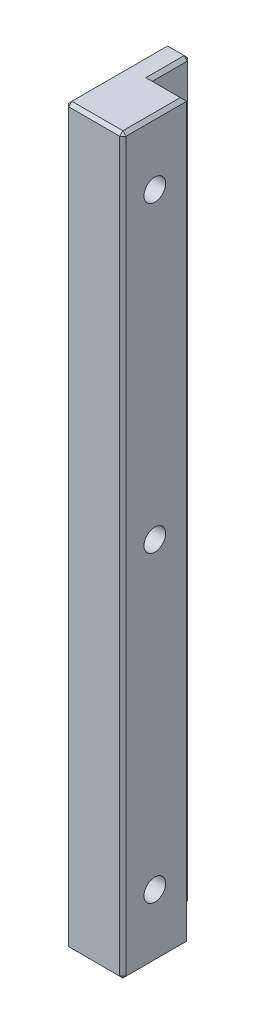
ISO-10303-21;
HEADER;
FILE_DESCRIPTION(('STEP AP214'),'2;1');
FILE_NAME('part.step','',(''),(''),'','','');
FILE_SCHEMA(('AUTOMOTIVE_DESIGN { 1 0 10303 214 1 1 1 1 }'));
ENDSEC;
DATA;
#1=APPLICATION_CONTEXT('core data for automotive mechanical design processes');
#2=APPLICATION_PROTOCOL_DEFINITION('international standard','automotive_design',2000,#1);
#3=PRODUCT_CONTEXT('',#1,'mechanical');
#4=PRODUCT('Part','Part','',(#3));
#5=PRODUCT_RELATED_PRODUCT_CATEGORY('part','',(#4));
#6=PRODUCT_DEFINITION_FORMATION('','',#4);
#7=PRODUCT_DEFINITION_CONTEXT('part definition',#1,'design');
#8=PRODUCT_DEFINITION('design','',#6,#7);
#9=PRODUCT_DEFINITION_SHAPE('','',#8);
#10=(LENGTH_UNIT() NAMED_UNIT(*) SI_UNIT(.MILLI.,.METRE.));
#11=(NAMED_UNIT(*) PLANE_ANGLE_UNIT() SI_UNIT($,.RADIAN.));
#12=(NAMED_UNIT(*) SI_UNIT($,.STERADIAN.) SOLID_ANGLE_UNIT());
#13=UNCERTAINTY_MEASURE_WITH_UNIT(LENGTH_MEASURE(1.E-05),#10,'distance_accuracy_value','');
#14=(GEOMETRIC_REPRESENTATION_CONTEXT(3) GLOBAL_UNCERTAINTY_ASSIGNED_CONTEXT((#13)) GLOBAL_UNIT_ASSIGNED_CONTEXT((#10,
#11,#12)) REPRESENTATION_CONTEXT('',''));
#15=CARTESIAN_POINT('',(0.,0.,0.));
#16=DIRECTION('',(0.,0.,1.));
#17=DIRECTION('',(1.,0.,0.));
#18=AXIS2_PLACEMENT_3D('',#15,#16,#17);
#19=CARTESIAN_POINT('',(99.6018364876299,27.8498798221226,64.2000036621567));
#20=DIRECTION('',(0.,0.,-1.));
#21=DIRECTION('',(0.,-1.,0.));
#22=AXIS2_PLACEMENT_3D('',#19,#20,#21);
#23=PLANE('',#22);
#24=DIRECTION('',(1.,0.,0.));
#25=VECTOR('',#24,1.);
#26=CARTESIAN_POINT('',(100.05183648763,-86.6501201778776,64.2000036621583));
#27=LINE('',#26,#25);
#28=CARTESIAN_POINT('',(99.6018364876299,-86.6501201778776,64.2000036621583));
#29=VERTEX_POINT('',#28);
#30=CARTESIAN_POINT('',(105.00183648763,-86.6501201778776,64.2000036621583));
#31=VERTEX_POINT('',#30);
#32=EDGE_CURVE('E127',#29,#31,#27,.T.);
#33=ORIENTED_EDGE('',*,*,#32,.F.);
#34=DIRECTION('',(0.,-1.,0.));
#35=VECTOR('',#34,1.);
#36=CARTESIAN_POINT('',(99.6018364876299,27.8498798221226,64.2000036621567));
#37=LINE('',#36,#35);
#38=CARTESIAN_POINT('',(99.6018364876299,27.3498798221226,64.2000036621567));
#39=VERTEX_POINT('',#38);
#40=EDGE_CURVE('E27',#39,#29,#37,.T.);
#41=ORIENTED_EDGE('',*,*,#40,.F.);
#42=DIRECTION('',(-1.,0.,0.));
#43=VECTOR('',#42,1.);
#44=CARTESIAN_POINT('',(102.30183648763,27.3498798221226,64.2000036621567));
#45=LINE('',#44,#43);
#46=CARTESIAN_POINT('',(105.00183648763,27.3498798221226,64.2000036621567));
#47=VERTEX_POINT('',#46);
#48=EDGE_CURVE('E67',#47,#39,#45,.T.);
#49=ORIENTED_EDGE('',*,*,#48,.F.);
#50=DIRECTION('',(0.,-1.,0.));
#51=VECTOR('',#50,1.);
#52=CARTESIAN_POINT('',(105.00183648763,27.8498798221226,64.2000036621567));
#53=LINE('',#52,#51);
#54=EDGE_CURVE('E11',#47,#31,#53,.T.);
#55=ORIENTED_EDGE('',*,*,#54,.T.);
#56=EDGE_LOOP('',(#33,#41,#49,#55));
#57=FACE_BOUND('',#56,.T.);
#58=ADVANCED_FACE('F17',(#57),#23,.T.);
#59=CARTESIAN_POINT('',(105.00183648763,27.8498798221226,64.2000036621567));
#60=DIRECTION('',(1.,0.,0.));
#61=DIRECTION('',(0.,1.,0.));
#62=AXIS2_PLACEMENT_3D('',#59,#60,#61);
#63=PLANE('',#62);
#64=CARTESIAN_POINT('',(105.00183648763,17.8498798221227,69.2000036621568));
#65=DIRECTION('',(-1.,0.,0.));
#66=DIRECTION('',(0.,1.,0.));
#67=AXIS2_PLACEMENT_3D('',#64,#65,#66);
#68=CIRCLE('',#67,1.7);
#69=CARTESIAN_POINT('',(105.00183648763,19.5498798221227,69.2000036621568));
#70=VERTEX_POINT('',#69);
#71=EDGE_CURVE('E407',#70,#70,#68,.T.);
#72=ORIENTED_EDGE('',*,*,#71,.T.);
#73=EDGE_LOOP('',(#72));
#74=FACE_BOUND('',#73,.T.);
#75=CARTESIAN_POINT('',(105.00183648763,-77.1501201778776,69.2000036621582));
#76=DIRECTION('',(-1.,0.,0.));
#77=DIRECTION('',(0.,1.,0.));
#78=AXIS2_PLACEMENT_3D('',#75,#76,#77);
#79=CIRCLE('',#78,1.7);
#80=CARTESIAN_POINT('',(105.00183648763,-75.4501201778776,69.2000036621582));
#81=VERTEX_POINT('',#80);
#82=EDGE_CURVE('E414',#81,#81,#79,.T.);
#83=ORIENTED_EDGE('',*,*,#82,.T.);
#84=EDGE_LOOP('',(#83));
#85=FACE_BOUND('',#84,.T.);
#86=CARTESIAN_POINT('',(105.00183648763,-29.6501201778775,69.2000036621575));
#87=DIRECTION('',(-1.,0.,0.));
#88=DIRECTION('',(0.,1.,0.));
#89=AXIS2_PLACEMENT_3D('',#86,#87,#88);
#90=CIRCLE('',#89,1.7);
#91=CARTESIAN_POINT('',(105.00183648763,-27.9501201778775,69.2000036621575));
#92=VERTEX_POINT('',#91);
#93=EDGE_CURVE('E106',#92,#92,#90,.T.);
#94=ORIENTED_EDGE('',*,*,#93,.T.);
#95=EDGE_LOOP('',(#94));
#96=FACE_BOUND('',#95,.T.);
#97=DIRECTION('',(0.,0.,1.));
#98=VECTOR('',#97,1.);
#99=CARTESIAN_POINT('',(105.00183648763,-86.6501201778776,65.2000036621583));
#100=LINE('',#99,#98);
#101=CARTESIAN_POINT('',(105.00183648763,-86.6501201778775,73.7000036621583));
#102=VERTEX_POINT('',#101);
#103=EDGE_CURVE('E64',#31,#102,#100,.T.);
#104=ORIENTED_EDGE('',*,*,#103,.F.);
#105=ORIENTED_EDGE('',*,*,#54,.F.);
#106=DIRECTION('',(0.,0.,-1.));
#107=VECTOR('',#106,1.);
#108=CARTESIAN_POINT('',(105.00183648763,27.3498798221227,73.9500036621569));
#109=LINE('',#108,#107);
#110=CARTESIAN_POINT('',(105.00183648763,27.3498798221227,73.7000036621566));
#111=VERTEX_POINT('',#110);
#112=EDGE_CURVE('E60',#111,#47,#109,.T.);
#113=ORIENTED_EDGE('',*,*,#112,.F.);
#114=DIRECTION('',(0.,1.,0.));
#115=VECTOR('',#114,1.);
#116=CARTESIAN_POINT('',(105.00183648763,27.8498798221227,73.7000036621566));
#117=LINE('',#116,#115);
#118=EDGE_CURVE('E235',#102,#111,#117,.T.);
#119=ORIENTED_EDGE('',*,*,#118,.F.);
#120=EDGE_LOOP('',(#104,#105,#113,#119));
#121=FACE_BOUND('',#120,.T.);
#122=ADVANCED_FACE('F56',(#74,#85,#96,#121),#63,.T.);
#123=CARTESIAN_POINT('',(96.0018364876299,27.8498798221225,58.2000036621567));
#124=DIRECTION('',(0.,0.,-1.));
#125=DIRECTION('',(0.,-1.,0.));
#126=AXIS2_PLACEMENT_3D('',#123,#124,#125);
#127=PLANE('',#126);
#128=DIRECTION('',(0.,1.,0.));
#129=VECTOR('',#128,1.);
#130=CARTESIAN_POINT('',(99.1018364876298,27.8498798221225,58.2000036621566));
#131=LINE('',#130,#129);
#132=CARTESIAN_POINT('',(99.1018364876298,-86.6501201778777,58.2000036621583));
#133=VERTEX_POINT('',#132);
#134=CARTESIAN_POINT('',(99.1018364876298,27.3498798221225,58.2000036621567));
#135=VERTEX_POINT('',#134);
#136=EDGE_CURVE('E240',#133,#135,#131,.T.);
#137=ORIENTED_EDGE('',*,*,#136,.F.);
#138=DIRECTION('',(1.,0.,0.));
#139=VECTOR('',#138,1.);
#140=CARTESIAN_POINT('',(98.2518364876299,-86.6501201778777,58.2000036621583));
#141=LINE('',#140,#139);
#142=CARTESIAN_POINT('',(96.5018364876299,-86.6501201778777,58.2000036621583));
#143=VERTEX_POINT('',#142);
#144=EDGE_CURVE('E187',#143,#133,#141,.T.);
#145=ORIENTED_EDGE('',*,*,#144,.F.);
#146=DIRECTION('',(0.,-1.,0.));
#147=VECTOR('',#146,1.);
#148=CARTESIAN_POINT('',(96.5018364876299,27.8498798221225,58.2000036621567));
#149=LINE('',#148,#147);
#150=CARTESIAN_POINT('',(96.5018364876299,27.3498798221225,58.2000036621567));
#151=VERTEX_POINT('',#150);
#152=EDGE_CURVE('E260',#151,#143,#149,.T.);
#153=ORIENTED_EDGE('',*,*,#152,.F.);
#154=DIRECTION('',(-1.,0.,0.));
#155=VECTOR('',#154,1.);
#156=CARTESIAN_POINT('',(100.50183648763,27.3498798221225,58.2000036621566));
#157=LINE('',#156,#155);
#158=EDGE_CURVE('E252',#135,#151,#157,.T.);
#159=ORIENTED_EDGE('',*,*,#158,.F.);
#160=EDGE_LOOP('',(#137,#145,#153,#159));
#161=FACE_BOUND('',#160,.T.);
#162=ADVANCED_FACE('F452',(#161),#127,.T.);
#163=CARTESIAN_POINT('',(105.00183648763,27.8498798221229,83.7000036621571));
#164=DIRECTION('',(0.,1.,0.));
#165=DIRECTION('',(0.,0.,-1.));
#166=AXIS2_PLACEMENT_3D('',#163,#164,#165);
#167=PLANE('',#166);
#168=DIRECTION('',(0.,0.,1.));
#169=VECTOR('',#168,1.);
#170=CARTESIAN_POINT('',(104.50183648763,27.8498798221227,73.9500036621568));
#171=LINE('',#170,#169);
#172=CARTESIAN_POINT('',(104.50183648763,27.8498798221226,64.7000036621566));
#173=VERTEX_POINT('',#172);
#174=CARTESIAN_POINT('',(104.50183648763,27.8498798221227,73.7000036621566));
#175=VERTEX_POINT('',#174);
#176=EDGE_CURVE('E89',#173,#175,#171,.T.);
#177=ORIENTED_EDGE('',*,*,#176,.F.);
#178=DIRECTION('',(1.,0.,0.));
#179=VECTOR('',#178,1.);
#180=CARTESIAN_POINT('',(102.30183648763,27.8498798221226,64.7000036621566));
#181=LINE('',#180,#179);
#182=CARTESIAN_POINT('',(99.1018364876298,27.8498798221226,64.7000036621566));
#183=VERTEX_POINT('',#182);
#184=EDGE_CURVE('E73',#183,#173,#181,.T.);
#185=ORIENTED_EDGE('',*,*,#184,.F.);
#186=DIRECTION('',(0.,0.,1.));
#187=VECTOR('',#186,1.);
#188=CARTESIAN_POINT('',(99.1018364876299,27.8498798221227,70.9500036621569));
#189=LINE('',#188,#187);
#190=CARTESIAN_POINT('',(99.1018364876298,27.8498798221225,58.7000036621566));
#191=VERTEX_POINT('',#190);
#192=EDGE_CURVE('E140',#191,#183,#189,.T.);
#193=ORIENTED_EDGE('',*,*,#192,.F.);
#194=DIRECTION('',(1.,0.,0.));
#195=VECTOR('',#194,1.);
#196=CARTESIAN_POINT('',(100.50183648763,27.8498798221225,58.7000036621566));
#197=LINE('',#196,#195);
#198=CARTESIAN_POINT('',(96.5018364876299,27.8498798221225,58.7000036621567));
#199=VERTEX_POINT('',#198);
#200=EDGE_CURVE('E256',#199,#191,#197,.T.);
#201=ORIENTED_EDGE('',*,*,#200,.F.);
#202=DIRECTION('',(0.,0.,-1.));
#203=VECTOR('',#202,1.);
#204=CARTESIAN_POINT('',(96.5018364876299,27.8498798221228,78.9500036621568));
#205=LINE('',#204,#203);
#206=CARTESIAN_POINT('',(96.5018364876299,27.8498798221227,73.7000036621566));
#207=VERTEX_POINT('',#206);
#208=EDGE_CURVE('E221',#207,#199,#205,.T.);
#209=ORIENTED_EDGE('',*,*,#208,.F.);
#210=DIRECTION('',(-1.,0.,0.));
#211=VECTOR('',#210,1.);
#212=CARTESIAN_POINT('',(105.00183648763,27.8498798221227,73.7000036621566));
#213=LINE('',#212,#211);
#214=EDGE_CURVE('E99',#175,#207,#213,.T.);
#215=ORIENTED_EDGE('',*,*,#214,.F.);
#216=EDGE_LOOP('',(#177,#185,#193,#201,#209,#215));
#217=FACE_BOUND('',#216,.T.);
#218=ADVANCED_FACE('F360',(#217),#167,.T.);
#219=CARTESIAN_POINT('',(105.00183648763,27.8498798221227,74.2000036621566));
#220=DIRECTION('',(0.,0.,1.));
#221=DIRECTION('',(0.,-1.,0.));
#222=AXIS2_PLACEMENT_3D('',#219,#220,#221);
#223=PLANE('',#222);
#224=DIRECTION('',(-1.,0.,0.));
#225=VECTOR('',#224,1.);
#226=CARTESIAN_POINT('',(102.75183648763,-86.6501201778775,74.2000036621583));
#227=LINE('',#226,#225);
#228=CARTESIAN_POINT('',(104.50183648763,-86.6501201778775,74.2000036621583));
#229=VERTEX_POINT('',#228);
#230=CARTESIAN_POINT('',(96.5018364876299,-86.6501201778775,74.2000036621583));
#231=VERTEX_POINT('',#230);
#232=EDGE_CURVE('E205',#229,#231,#227,.T.);
#233=ORIENTED_EDGE('',*,*,#232,.F.);
#234=DIRECTION('',(0.,-1.,0.));
#235=VECTOR('',#234,1.);
#236=CARTESIAN_POINT('',(104.50183648763,27.8498798221227,74.2000036621566));
#237=LINE('',#236,#235);
#238=CARTESIAN_POINT('',(104.50183648763,27.3498798221227,74.2000036621566));
#239=VERTEX_POINT('',#238);
#240=EDGE_CURVE('E141',#239,#229,#237,.T.);
#241=ORIENTED_EDGE('',*,*,#240,.F.);
#242=DIRECTION('',(1.,0.,0.));
#243=VECTOR('',#242,1.);
#244=CARTESIAN_POINT('',(105.00183648763,27.3498798221227,74.2000036621566));
#245=LINE('',#244,#243);
#246=CARTESIAN_POINT('',(96.5018364876299,27.3498798221227,74.2000036621566));
#247=VERTEX_POINT('',#246);
#248=EDGE_CURVE('E111',#247,#239,#245,.T.);
#249=ORIENTED_EDGE('',*,*,#248,.F.);
#250=DIRECTION('',(0.,1.,0.));
#251=VECTOR('',#250,1.);
#252=CARTESIAN_POINT('',(96.5018364876299,27.8498798221227,74.2000036621566));
#253=LINE('',#252,#251);
#254=EDGE_CURVE('E226',#231,#247,#253,.T.);
#255=ORIENTED_EDGE('',*,*,#254,.F.);
#256=EDGE_LOOP('',(#233,#241,#249,#255));
#257=FACE_BOUND('',#256,.T.);
#258=ADVANCED_FACE('F503',(#257),#223,.T.);
#259=CARTESIAN_POINT('',(100.50183648763,-87.1501201778776,66.2000036621583));
#260=DIRECTION('',(0.,-1.,0.));
#261=DIRECTION('',(-1.,0.,0.));
#262=AXIS2_PLACEMENT_3D('',#259,#260,#261);
#263=PLANE('',#262);
#264=DIRECTION('',(0.,0.,1.));
#265=VECTOR('',#264,1.);
#266=CARTESIAN_POINT('',(96.5018364876299,-87.1501201778776,70.2000036621583));
#267=LINE('',#266,#265);
#268=CARTESIAN_POINT('',(96.5018364876299,-87.1501201778777,58.7000036621583));
#269=VERTEX_POINT('',#268);
#270=CARTESIAN_POINT('',(96.5018364876299,-87.1501201778775,73.7000036621583));
#271=VERTEX_POINT('',#270);
#272=EDGE_CURVE('E160',#269,#271,#267,.T.);
#273=ORIENTED_EDGE('',*,*,#272,.F.);
#274=DIRECTION('',(-1.,0.,0.));
#275=VECTOR('',#274,1.);
#276=CARTESIAN_POINT('',(98.2518364876299,-87.1501201778777,58.7000036621583));
#277=LINE('',#276,#275);
#278=CARTESIAN_POINT('',(99.1018364876298,-87.1501201778777,58.7000036621583));
#279=VERTEX_POINT('',#278);
#280=EDGE_CURVE('E20',#279,#269,#277,.T.);
#281=ORIENTED_EDGE('',*,*,#280,.F.);
#282=DIRECTION('',(0.,0.,-1.));
#283=VECTOR('',#282,1.);
#284=CARTESIAN_POINT('',(99.1018364876298,-87.1501201778777,62.2000036621583));
#285=LINE('',#284,#283);
#286=CARTESIAN_POINT('',(99.1018364876298,-87.1501201778776,64.7000036621583));
#287=VERTEX_POINT('',#286);
#288=EDGE_CURVE('E264',#287,#279,#285,.T.);
#289=ORIENTED_EDGE('',*,*,#288,.F.);
#290=DIRECTION('',(-1.,0.,0.));
#291=VECTOR('',#290,1.);
#292=CARTESIAN_POINT('',(100.05183648763,-87.1501201778776,64.7000036621583));
#293=LINE('',#292,#291);
#294=CARTESIAN_POINT('',(104.50183648763,-87.1501201778776,64.7000036621583));
#295=VERTEX_POINT('',#294);
#296=EDGE_CURVE('E135',#295,#287,#293,.T.);
#297=ORIENTED_EDGE('',*,*,#296,.F.);
#298=DIRECTION('',(0.,0.,-1.));
#299=VECTOR('',#298,1.);
#300=CARTESIAN_POINT('',(104.50183648763,-87.1501201778776,65.2000036621583));
#301=LINE('',#300,#299);
#302=CARTESIAN_POINT('',(104.50183648763,-87.1501201778775,73.7000036621583));
#303=VERTEX_POINT('',#302);
#304=EDGE_CURVE('E211',#303,#295,#301,.T.);
#305=ORIENTED_EDGE('',*,*,#304,.F.);
#306=DIRECTION('',(1.,0.,0.));
#307=VECTOR('',#306,1.);
#308=CARTESIAN_POINT('',(102.75183648763,-87.1501201778775,73.7000036621583));
#309=LINE('',#308,#307);
#310=EDGE_CURVE('E212',#271,#303,#309,.T.);
#311=ORIENTED_EDGE('',*,*,#310,.F.);
#312=EDGE_LOOP('',(#273,#281,#289,#297,#305,#311));
#313=FACE_BOUND('',#312,.T.);
#314=ADVANCED_FACE('F299',(#313),#263,.T.);
#315=CARTESIAN_POINT('',(99.6018364876298,27.8498798221225,58.2000036621566));
#316=DIRECTION('',(1.,0.,0.));
#317=DIRECTION('',(0.,0.,-1.));
#318=AXIS2_PLACEMENT_3D('',#315,#316,#317);
#319=PLANE('',#318);
#320=DIRECTION('',(0.,0.,1.));
#321=VECTOR('',#320,1.);
#322=CARTESIAN_POINT('',(99.6018364876298,-86.6501201778777,62.2000036621583));
#323=LINE('',#322,#321);
#324=CARTESIAN_POINT('',(99.6018364876298,-86.6501201778777,58.7000036621583));
#325=VERTEX_POINT('',#324);
#326=EDGE_CURVE('E191',#325,#29,#323,.T.);
#327=ORIENTED_EDGE('',*,*,#326,.F.);
#328=DIRECTION('',(0.,-1.,0.));
#329=VECTOR('',#328,1.);
#330=CARTESIAN_POINT('',(99.6018364876298,27.8498798221225,58.7000036621566));
#331=LINE('',#330,#329);
#332=CARTESIAN_POINT('',(99.6018364876298,27.3498798221225,58.7000036621566));
#333=VERTEX_POINT('',#332);
#334=EDGE_CURVE('E248',#333,#325,#331,.T.);
#335=ORIENTED_EDGE('',*,*,#334,.F.);
#336=DIRECTION('',(0.,0.,-1.));
#337=VECTOR('',#336,1.);
#338=CARTESIAN_POINT('',(99.6018364876299,27.3498798221227,70.9500036621569));
#339=LINE('',#338,#337);
#340=EDGE_CURVE('E136',#39,#333,#339,.T.);
#341=ORIENTED_EDGE('',*,*,#340,.F.);
#342=ORIENTED_EDGE('',*,*,#40,.T.);
#343=EDGE_LOOP('',(#327,#335,#341,#342));
#344=FACE_BOUND('',#343,.T.);
#345=ADVANCED_FACE('F499',(#344),#319,.T.);
#346=CARTESIAN_POINT('',(98.2518364876299,-86.9001201778777,58.4500036621583));
#347=DIRECTION('',(0.,-0.707106781186548,-0.707106781186548));
#348=DIRECTION('',(0.,-0.707106781186548,0.707106781186548));
#349=AXIS2_PLACEMENT_3D('',#346,#347,#348);
#350=PLANE('',#349);
#351=DIRECTION('',(0.,0.707106781186548,-0.707106781186548));
#352=VECTOR('',#351,1.);
#353=CARTESIAN_POINT('',(96.5018364876299,-87.1501201778777,58.7000036621583));
#354=LINE('',#353,#352);
#355=EDGE_CURVE('E105',#269,#143,#354,.T.);
#356=ORIENTED_EDGE('',*,*,#355,.T.);
#357=ORIENTED_EDGE('',*,*,#144,.T.);
#358=DIRECTION('',(0.,-0.707106781186548,0.707106781186548));
#359=VECTOR('',#358,1.);
#360=CARTESIAN_POINT('',(99.1018364876298,-86.6501201778777,58.2000036621583));
#361=LINE('',#360,#359);
#362=EDGE_CURVE('E123',#133,#279,#361,.T.);
#363=ORIENTED_EDGE('',*,*,#362,.T.);
#364=ORIENTED_EDGE('',*,*,#280,.T.);
#365=EDGE_LOOP('',(#356,#357,#363,#364));
#366=FACE_BOUND('',#365,.T.);
#367=ADVANCED_FACE('F496',(#366),#350,.T.);
#368=CARTESIAN_POINT('',(99.3518364876298,-86.9001201778777,62.2000036621583));
#369=DIRECTION('',(0.707106781186548,-0.707106781186548,0.));
#370=DIRECTION('',(0.,0.,-1.));
#371=AXIS2_PLACEMENT_3D('',#368,#369,#370);
#372=PLANE('',#371);
#373=ORIENTED_EDGE('',*,*,#288,.T.);
#374=DIRECTION('',(0.707106781186548,0.707106781186548,0.));
#375=VECTOR('',#374,1.);
#376=CARTESIAN_POINT('',(99.1018364876298,-87.1501201778777,58.7000036621583));
#377=LINE('',#376,#375);
#378=EDGE_CURVE('E122',#279,#325,#377,.T.);
#379=ORIENTED_EDGE('',*,*,#378,.T.);
#380=ORIENTED_EDGE('',*,*,#326,.T.);
#381=DIRECTION('',(0.577350269189629,0.577350269189629,-0.577350269189619));
#382=VECTOR('',#381,1.);
#383=CARTESIAN_POINT('',(99.1018364876298,-87.1501201778776,64.7000036621583));
#384=LINE('',#383,#382);
#385=EDGE_CURVE('E145',#287,#29,#384,.T.);
#386=ORIENTED_EDGE('',*,*,#385,.F.);
#387=EDGE_LOOP('',(#373,#379,#380,#386));
#388=FACE_BOUND('',#387,.T.);
#389=ADVANCED_FACE('F278',(#388),#372,.T.);
#390=CARTESIAN_POINT('',(96.2518364876299,27.8498798221225,58.4500036621567));
#391=DIRECTION('',(-0.707106781186548,0.,-0.707106781186548));
#392=DIRECTION('',(-0.707106781186548,0.,0.707106781186548));
#393=AXIS2_PLACEMENT_3D('',#390,#391,#392);
#394=PLANE('',#393);
#395=DIRECTION('',(-0.707106781186548,0.,0.707106781186548));
#396=VECTOR('',#395,1.);
#397=CARTESIAN_POINT('',(96.5018364876299,-86.6501201778777,58.2000036621583));
#398=LINE('',#397,#396);
#399=CARTESIAN_POINT('',(96.0018364876299,-86.6501201778777,58.7000036621583));
#400=VERTEX_POINT('',#399);
#401=EDGE_CURVE('E101',#143,#400,#398,.T.);
#402=ORIENTED_EDGE('',*,*,#401,.T.);
#403=DIRECTION('',(0.,1.,0.));
#404=VECTOR('',#403,1.);
#405=CARTESIAN_POINT('',(96.0018364876299,27.8498798221225,58.7000036621567));
#406=LINE('',#405,#404);
#407=CARTESIAN_POINT('',(96.0018364876299,27.3498798221225,58.7000036621567));
#408=VERTEX_POINT('',#407);
#409=EDGE_CURVE('E928',#400,#408,#406,.T.);
#410=ORIENTED_EDGE('',*,*,#409,.T.);
#411=DIRECTION('',(0.707106781186548,0.,-0.707106781186548));
#412=VECTOR('',#411,1.);
#413=CARTESIAN_POINT('',(96.0018364876299,27.3498798221225,58.7000036621567));
#414=LINE('',#413,#412);
#415=EDGE_CURVE('E172',#408,#151,#414,.T.);
#416=ORIENTED_EDGE('',*,*,#415,.T.);
#417=ORIENTED_EDGE('',*,*,#152,.T.);
#418=EDGE_LOOP('',(#402,#410,#416,#417));
#419=FACE_BOUND('',#418,.T.);
#420=ADVANCED_FACE('F494',(#419),#394,.T.);
#421=CARTESIAN_POINT('',(100.50183648763,27.5998798221225,58.4500036621566));
#422=DIRECTION('',(0.,0.707106781186544,-0.707106781186551));
#423=DIRECTION('',(-1.,0.,0.));
#424=AXIS2_PLACEMENT_3D('',#421,#422,#423);
#425=PLANE('',#424);
#426=DIRECTION('',(0.,-0.707106781186551,-0.707106781186544));
#427=VECTOR('',#426,1.);
#428=CARTESIAN_POINT('',(99.1018364876298,27.8498798221225,58.7000036621566));
#429=LINE('',#428,#427);
#430=EDGE_CURVE('E176',#191,#135,#429,.T.);
#431=ORIENTED_EDGE('',*,*,#430,.T.);
#432=ORIENTED_EDGE('',*,*,#158,.T.);
#433=DIRECTION('',(0.,0.707106781186551,0.707106781186544));
#434=VECTOR('',#433,1.);
#435=CARTESIAN_POINT('',(96.5018364876299,27.3498798221225,58.2000036621567));
#436=LINE('',#435,#434);
#437=EDGE_CURVE('E168',#151,#199,#436,.T.);
#438=ORIENTED_EDGE('',*,*,#437,.T.);
#439=ORIENTED_EDGE('',*,*,#200,.T.);
#440=EDGE_LOOP('',(#431,#432,#438,#439));
#441=FACE_BOUND('',#440,.T.);
#442=ADVANCED_FACE('F490',(#441),#425,.T.);
#443=CARTESIAN_POINT('',(99.3518364876298,27.8498798221225,58.4500036621566));
#444=DIRECTION('',(0.707106781186541,0.,-0.707106781186554));
#445=DIRECTION('',(0.,-1.,0.));
#446=AXIS2_PLACEMENT_3D('',#443,#444,#445);
#447=PLANE('',#446);
#448=DIRECTION('',(-0.707106781186554,0.,-0.707106781186541));
#449=VECTOR('',#448,1.);
#450=CARTESIAN_POINT('',(99.6018364876298,-86.6501201778777,58.7000036621583));
#451=LINE('',#450,#449);
#452=EDGE_CURVE('E118',#325,#133,#451,.T.);
#453=ORIENTED_EDGE('',*,*,#452,.T.);
#454=ORIENTED_EDGE('',*,*,#136,.T.);
#455=DIRECTION('',(0.707106781186554,0.,0.707106781186541));
#456=VECTOR('',#455,1.);
#457=CARTESIAN_POINT('',(99.1018364876298,27.3498798221225,58.2000036621567));
#458=LINE('',#457,#456);
#459=EDGE_CURVE('E182',#135,#333,#458,.T.);
#460=ORIENTED_EDGE('',*,*,#459,.T.);
#461=ORIENTED_EDGE('',*,*,#334,.T.);
#462=EDGE_LOOP('',(#453,#454,#460,#461));
#463=FACE_BOUND('',#462,.T.);
#464=ADVANCED_FACE('F486',(#463),#447,.T.);
#465=CARTESIAN_POINT('',(99.3518364876299,27.5998798221227,70.9500036621569));
#466=DIRECTION('',(0.707106781186538,0.707106781186557,0.));
#467=DIRECTION('',(0.,0.,-1.));
#468=AXIS2_PLACEMENT_3D('',#465,#466,#467);
#469=PLANE('',#468);
#470=ORIENTED_EDGE('',*,*,#340,.T.);
#471=DIRECTION('',(-0.707106781186557,0.707106781186538,0.));
#472=VECTOR('',#471,1.);
#473=CARTESIAN_POINT('',(99.6018364876298,27.3498798221225,58.7000036621566));
#474=LINE('',#473,#472);
#475=EDGE_CURVE('E186',#333,#191,#474,.T.);
#476=ORIENTED_EDGE('',*,*,#475,.T.);
#477=ORIENTED_EDGE('',*,*,#192,.T.);
#478=DIRECTION('',(-0.577350269189638,0.577350269189633,0.577350269189607));
#479=VECTOR('',#478,1.);
#480=CARTESIAN_POINT('',(99.6018364876299,27.3498798221226,64.2000036621567));
#481=LINE('',#480,#479);
#482=EDGE_CURVE('E72',#39,#183,#481,.T.);
#483=ORIENTED_EDGE('',*,*,#482,.F.);
#484=EDGE_LOOP('',(#470,#476,#477,#483));
#485=FACE_BOUND('',#484,.T.);
#486=ADVANCED_FACE('F483',(#485),#469,.T.);
#487=CARTESIAN_POINT('',(104.75183648763,27.8498798221227,73.9500036621566));
#488=DIRECTION('',(0.707106781186541,0.,0.707106781186554));
#489=DIRECTION('',(0.,-1.,0.));
#490=AXIS2_PLACEMENT_3D('',#487,#488,#489);
#491=PLANE('',#490);
#492=DIRECTION('',(0.707106781186554,0.,-0.707106781186541));
#493=VECTOR('',#492,1.);
#494=CARTESIAN_POINT('',(104.50183648763,-86.6501201778775,74.2000036621583));
#495=LINE('',#494,#493);
#496=EDGE_CURVE('E177',#229,#102,#495,.T.);
#497=ORIENTED_EDGE('',*,*,#496,.T.);
#498=ORIENTED_EDGE('',*,*,#118,.T.);
#499=DIRECTION('',(-0.707106781186554,0.,0.707106781186541));
#500=VECTOR('',#499,1.);
#501=CARTESIAN_POINT('',(105.00183648763,27.3498798221227,73.7000036621566));
#502=LINE('',#501,#500);
#503=EDGE_CURVE('E208',#111,#239,#502,.T.);
#504=ORIENTED_EDGE('',*,*,#503,.T.);
#505=ORIENTED_EDGE('',*,*,#240,.T.);
#506=EDGE_LOOP('',(#497,#498,#504,#505));
#507=FACE_BOUND('',#506,.T.);
#508=ADVANCED_FACE('F370',(#507),#491,.T.);
#509=CARTESIAN_POINT('',(105.00183648763,27.5998798221227,73.9500036621566));
#510=DIRECTION('',(0.,0.707106781186563,0.707106781186532));
#511=DIRECTION('',(1.,0.,0.));
#512=AXIS2_PLACEMENT_3D('',#509,#510,#511);
#513=PLANE('',#512);
#514=DIRECTION('',(0.,-0.707106781186532,0.707106781186563));
#515=VECTOR('',#514,1.);
#516=CARTESIAN_POINT('',(96.5018364876299,27.8498798221227,73.7000036621566));
#517=LINE('',#516,#515);
#518=EDGE_CURVE('E216',#207,#247,#517,.T.);
#519=ORIENTED_EDGE('',*,*,#518,.T.);
#520=ORIENTED_EDGE('',*,*,#248,.T.);
#521=DIRECTION('',(0.,0.707106781186532,-0.707106781186563));
#522=VECTOR('',#521,1.);
#523=CARTESIAN_POINT('',(104.50183648763,27.3498798221227,74.2000036621566));
#524=LINE('',#523,#522);
#525=EDGE_CURVE('E95',#239,#175,#524,.T.);
#526=ORIENTED_EDGE('',*,*,#525,.T.);
#527=ORIENTED_EDGE('',*,*,#214,.T.);
#528=EDGE_LOOP('',(#519,#520,#526,#527));
#529=FACE_BOUND('',#528,.T.);
#530=ADVANCED_FACE('F366',(#529),#513,.T.);
#531=CARTESIAN_POINT('',(102.30183648763,27.5998798221226,64.4500036621567));
#532=DIRECTION('',(0.,0.707106781186529,-0.707106781186566));
#533=DIRECTION('',(-1.,0.,0.));
#534=AXIS2_PLACEMENT_3D('',#531,#532,#533);
#535=PLANE('',#534);
#536=ORIENTED_EDGE('',*,*,#184,.T.);
#537=DIRECTION('',(-0.577350269189624,0.577350269189639,0.577350269189614));
#538=VECTOR('',#537,1.);
#539=CARTESIAN_POINT('',(105.00183648763,27.3498798221226,64.2000036621567));
#540=LINE('',#539,#538);
#541=EDGE_CURVE('E76',#47,#173,#540,.T.);
#542=ORIENTED_EDGE('',*,*,#541,.F.);
#543=ORIENTED_EDGE('',*,*,#48,.T.);
#544=ORIENTED_EDGE('',*,*,#482,.T.);
#545=EDGE_LOOP('',(#536,#542,#543,#544));
#546=FACE_BOUND('',#545,.T.);
#547=ADVANCED_FACE('F77',(#546),#535,.T.);
#548=CARTESIAN_POINT('',(104.75183648763,27.5998798221227,73.9500036621568));
#549=DIRECTION('',(0.707106781186541,0.707106781186554,0.));
#550=DIRECTION('',(0.,0.,-1.));
#551=AXIS2_PLACEMENT_3D('',#548,#549,#550);
#552=PLANE('',#551);
#553=ORIENTED_EDGE('',*,*,#176,.T.);
#554=DIRECTION('',(0.707106781186554,-0.707106781186541,0.));
#555=VECTOR('',#554,1.);
#556=CARTESIAN_POINT('',(104.50183648763,27.8498798221227,73.7000036621566));
#557=LINE('',#556,#555);
#558=EDGE_CURVE('E86',#175,#111,#557,.T.);
#559=ORIENTED_EDGE('',*,*,#558,.T.);
#560=ORIENTED_EDGE('',*,*,#112,.T.);
#561=ORIENTED_EDGE('',*,*,#541,.T.);
#562=EDGE_LOOP('',(#553,#559,#560,#561));
#563=FACE_BOUND('',#562,.T.);
#564=ADVANCED_FACE('F84',(#563),#552,.T.);
#565=CARTESIAN_POINT('',(104.50183648763,27.8498798221227,73.7000036621566));
#566=DIRECTION('',(0.577350269189614,0.577350269189645,0.577350269189619));
#567=DIRECTION('',(0.707106781186551,0.,-0.707106781186545));
#568=AXIS2_PLACEMENT_3D('',#565,#566,#567);
#569=PLANE('',#568);
#570=ORIENTED_EDGE('',*,*,#503,.F.);
#571=ORIENTED_EDGE('',*,*,#558,.F.);
#572=ORIENTED_EDGE('',*,*,#525,.F.);
#573=EDGE_LOOP('',(#570,#571,#572));
#574=FACE_BOUND('',#573,.T.);
#575=ADVANCED_FACE('F368',(#574),#569,.T.);
#576=CARTESIAN_POINT('',(96.2518364876299,27.8498798221227,73.9500036621566));
#577=DIRECTION('',(-0.707106781186548,0.,0.707106781186548));
#578=DIRECTION('',(0.,1.,0.));
#579=AXIS2_PLACEMENT_3D('',#576,#577,#578);
#580=PLANE('',#579);
#581=DIRECTION('',(0.707106781186548,0.,0.707106781186548));
#582=VECTOR('',#581,1.);
#583=CARTESIAN_POINT('',(96.0018364876299,-86.6501201778775,73.7000036621583));
#584=LINE('',#583,#582);
#585=CARTESIAN_POINT('',(96.0018364876299,-86.6501201778775,73.7000036621583));
#586=VERTEX_POINT('',#585);
#587=EDGE_CURVE('E149',#586,#231,#584,.T.);
#588=ORIENTED_EDGE('',*,*,#587,.T.);
#589=ORIENTED_EDGE('',*,*,#254,.T.);
#590=DIRECTION('',(-0.707106781186548,0.,-0.707106781186548));
#591=VECTOR('',#590,1.);
#592=CARTESIAN_POINT('',(96.5018364876299,27.3498798221227,74.2000036621566));
#593=LINE('',#592,#591);
#594=CARTESIAN_POINT('',(96.0018364876299,27.3498798221227,73.7000036621566));
#595=VERTEX_POINT('',#594);
#596=EDGE_CURVE('E217',#247,#595,#593,.T.);
#597=ORIENTED_EDGE('',*,*,#596,.T.);
#598=DIRECTION('',(0.,-1.,0.));
#599=VECTOR('',#598,1.);
#600=CARTESIAN_POINT('',(96.0018364876299,27.8498798221227,73.7000036621566));
#601=LINE('',#600,#599);
#602=EDGE_CURVE('E401',#595,#586,#601,.T.);
#603=ORIENTED_EDGE('',*,*,#602,.T.);
#604=EDGE_LOOP('',(#588,#589,#597,#603));
#605=FACE_BOUND('',#604,.T.);
#606=ADVANCED_FACE('F471',(#605),#580,.T.);
#607=CARTESIAN_POINT('',(96.2518364876299,27.5998798221228,78.9500036621568));
#608=DIRECTION('',(-0.707106781186557,0.707106781186538,0.));
#609=DIRECTION('',(0.,0.,1.));
#610=AXIS2_PLACEMENT_3D('',#607,#608,#609);
#611=PLANE('',#610);
#612=DIRECTION('',(-0.707106781186538,-0.707106781186557,0.));
#613=VECTOR('',#612,1.);
#614=CARTESIAN_POINT('',(96.5018364876299,27.8498798221225,58.7000036621567));
#615=LINE('',#614,#613);
#616=EDGE_CURVE('E164',#199,#408,#615,.T.);
#617=ORIENTED_EDGE('',*,*,#616,.T.);
#618=DIRECTION('',(0.,0.,1.));
#619=VECTOR('',#618,1.);
#620=CARTESIAN_POINT('',(96.0018364876299,27.3498798221228,78.9500036621568));
#621=LINE('',#620,#619);
#622=EDGE_CURVE('E935',#408,#595,#621,.T.);
#623=ORIENTED_EDGE('',*,*,#622,.T.);
#624=DIRECTION('',(0.707106781186538,0.707106781186557,0.));
#625=VECTOR('',#624,1.);
#626=CARTESIAN_POINT('',(96.0018364876299,27.3498798221227,73.7000036621566));
#627=LINE('',#626,#625);
#628=EDGE_CURVE('E222',#595,#207,#627,.T.);
#629=ORIENTED_EDGE('',*,*,#628,.T.);
#630=ORIENTED_EDGE('',*,*,#208,.T.);
#631=EDGE_LOOP('',(#617,#623,#629,#630));
#632=FACE_BOUND('',#631,.T.);
#633=ADVANCED_FACE('F467',(#632),#611,.T.);
#634=CARTESIAN_POINT('',(96.0018364876299,27.3498798221227,73.7000036621566));
#635=DIRECTION('',(-0.577350269189631,0.577350269189626,0.577350269189621));
#636=DIRECTION('',(0.707106781186541,0.,0.707106781186554));
#637=AXIS2_PLACEMENT_3D('',#634,#635,#636);
#638=PLANE('',#637);
#639=ORIENTED_EDGE('',*,*,#518,.F.);
#640=ORIENTED_EDGE('',*,*,#628,.F.);
#641=ORIENTED_EDGE('',*,*,#596,.F.);
#642=EDGE_LOOP('',(#639,#640,#641));
#643=FACE_BOUND('',#642,.T.);
#644=ADVANCED_FACE('F464',(#643),#638,.T.);
#645=CARTESIAN_POINT('',(104.75183648763,-86.9001201778776,65.2000036621583));
#646=DIRECTION('',(0.707106781186548,-0.707106781186548,0.));
#647=DIRECTION('',(0.,0.,-1.));
#648=AXIS2_PLACEMENT_3D('',#645,#646,#647);
#649=PLANE('',#648);
#650=ORIENTED_EDGE('',*,*,#103,.T.);
#651=DIRECTION('',(-0.707106781186548,-0.707106781186548,0.));
#652=VECTOR('',#651,1.);
#653=CARTESIAN_POINT('',(105.00183648763,-86.6501201778775,73.7000036621583));
#654=LINE('',#653,#652);
#655=EDGE_CURVE('E201',#102,#303,#654,.T.);
#656=ORIENTED_EDGE('',*,*,#655,.T.);
#657=ORIENTED_EDGE('',*,*,#304,.T.);
#658=DIRECTION('',(-0.577350269189622,-0.577350269189622,0.577350269189633));
#659=VECTOR('',#658,1.);
#660=CARTESIAN_POINT('',(105.00183648763,-86.6501201778776,64.2000036621583));
#661=LINE('',#660,#659);
#662=EDGE_CURVE('E131',#31,#295,#661,.T.);
#663=ORIENTED_EDGE('',*,*,#662,.F.);
#664=EDGE_LOOP('',(#650,#656,#657,#663));
#665=FACE_BOUND('',#664,.T.);
#666=ADVANCED_FACE('F375',(#665),#649,.T.);
#667=CARTESIAN_POINT('',(102.75183648763,-86.9001201778775,73.9500036621583));
#668=DIRECTION('',(0.,-0.707106781186529,0.707106781186566));
#669=DIRECTION('',(-1.,0.,0.));
#670=AXIS2_PLACEMENT_3D('',#667,#668,#669);
#671=PLANE('',#670);
#672=DIRECTION('',(0.,0.707106781186566,0.707106781186529));
#673=VECTOR('',#672,1.);
#674=CARTESIAN_POINT('',(104.50183648763,-87.1501201778775,73.7000036621583));
#675=LINE('',#674,#673);
#676=EDGE_CURVE('E181',#303,#229,#675,.T.);
#677=ORIENTED_EDGE('',*,*,#676,.T.);
#678=ORIENTED_EDGE('',*,*,#232,.T.);
#679=DIRECTION('',(0.,-0.707106781186566,-0.707106781186529));
#680=VECTOR('',#679,1.);
#681=CARTESIAN_POINT('',(96.5018364876299,-86.6501201778775,74.2000036621583));
#682=LINE('',#681,#680);
#683=EDGE_CURVE('E159',#231,#271,#682,.T.);
#684=ORIENTED_EDGE('',*,*,#683,.T.);
#685=ORIENTED_EDGE('',*,*,#310,.T.);
#686=EDGE_LOOP('',(#677,#678,#684,#685));
#687=FACE_BOUND('',#686,.T.);
#688=ADVANCED_FACE('F381',(#687),#671,.T.);
#689=CARTESIAN_POINT('',(104.50183648763,-87.1501201778775,73.7000036621583));
#690=DIRECTION('',(0.577350269189616,-0.577350269189616,0.577350269189646));
#691=DIRECTION('',(-0.707106781186548,-0.707106781186548,0.));
#692=AXIS2_PLACEMENT_3D('',#689,#690,#691);
#693=PLANE('',#692);
#694=ORIENTED_EDGE('',*,*,#496,.F.);
#695=ORIENTED_EDGE('',*,*,#676,.F.);
#696=ORIENTED_EDGE('',*,*,#655,.F.);
#697=EDGE_LOOP('',(#694,#695,#696));
#698=FACE_BOUND('',#697,.T.);
#699=ADVANCED_FACE('F378',(#698),#693,.T.);
#700=CARTESIAN_POINT('',(99.6018364876298,27.3498798221225,58.7000036621566));
#701=DIRECTION('',(0.577350269189612,0.577350269189628,-0.577350269189638));
#702=DIRECTION('',(-0.707106781186563,0.,-0.707106781186532));
#703=AXIS2_PLACEMENT_3D('',#700,#701,#702);
#704=PLANE('',#703);
#705=ORIENTED_EDGE('',*,*,#430,.F.);
#706=ORIENTED_EDGE('',*,*,#475,.F.);
#707=ORIENTED_EDGE('',*,*,#459,.F.);
#708=EDGE_LOOP('',(#705,#706,#707));
#709=FACE_BOUND('',#708,.T.);
#710=ADVANCED_FACE('F629',(#709),#704,.T.);
#711=CARTESIAN_POINT('',(96.5018364876299,27.3498798221225,58.2000036621567));
#712=DIRECTION('',(-0.577350269189631,0.57735026918961,-0.577350269189636));
#713=DIRECTION('',(-0.707106781186551,0.,0.707106781186545));
#714=AXIS2_PLACEMENT_3D('',#711,#712,#713);
#715=PLANE('',#714);
#716=ORIENTED_EDGE('',*,*,#616,.F.);
#717=ORIENTED_EDGE('',*,*,#437,.F.);
#718=ORIENTED_EDGE('',*,*,#415,.F.);
#719=EDGE_LOOP('',(#716,#717,#718));
#720=FACE_BOUND('',#719,.T.);
#721=ADVANCED_FACE('F636',(#720),#715,.T.);
#722=CARTESIAN_POINT('',(96.2518364876299,-86.9001201778775,70.2000036621583));
#723=DIRECTION('',(-0.70710678118656,-0.707106781186535,0.));
#724=DIRECTION('',(-0.707106781186535,0.70710678118656,0.));
#725=AXIS2_PLACEMENT_3D('',#722,#723,#724);
#726=PLANE('',#725);
#727=DIRECTION('',(-0.707106781186535,0.70710678118656,0.));
#728=VECTOR('',#727,1.);
#729=CARTESIAN_POINT('',(96.5018364876299,-87.1501201778775,73.7000036621583));
#730=LINE('',#729,#728);
#731=EDGE_CURVE('E153',#271,#586,#730,.T.);
#732=ORIENTED_EDGE('',*,*,#731,.T.);
#733=DIRECTION('',(0.,0.,-1.));
#734=VECTOR('',#733,1.);
#735=CARTESIAN_POINT('',(96.0018364876299,-86.6501201778775,70.2000036621583));
#736=LINE('',#735,#734);
#737=EDGE_CURVE('E919',#586,#400,#736,.T.);
#738=ORIENTED_EDGE('',*,*,#737,.T.);
#739=DIRECTION('',(0.707106781186535,-0.70710678118656,0.));
#740=VECTOR('',#739,1.);
#741=CARTESIAN_POINT('',(96.0018364876299,-86.6501201778777,58.7000036621583));
#742=LINE('',#741,#740);
#743=EDGE_CURVE('E109',#400,#269,#742,.T.);
#744=ORIENTED_EDGE('',*,*,#743,.T.);
#745=ORIENTED_EDGE('',*,*,#272,.T.);
#746=EDGE_LOOP('',(#732,#738,#744,#745));
#747=FACE_BOUND('',#746,.T.);
#748=ADVANCED_FACE('F645',(#747),#726,.T.);
#749=CARTESIAN_POINT('',(96.5018364876299,-87.1501201778775,73.7000036621583));
#750=DIRECTION('',(-0.577350269189629,-0.577350269189598,0.57735026918965));
#751=DIRECTION('',(-0.707106781186529,0.707106781186567,0.));
#752=AXIS2_PLACEMENT_3D('',#749,#750,#751);
#753=PLANE('',#752);
#754=ORIENTED_EDGE('',*,*,#587,.F.);
#755=ORIENTED_EDGE('',*,*,#731,.F.);
#756=ORIENTED_EDGE('',*,*,#683,.F.);
#757=EDGE_LOOP('',(#754,#755,#756));
#758=FACE_BOUND('',#757,.T.);
#759=ADVANCED_FACE('F654',(#758),#753,.T.);
#760=CARTESIAN_POINT('',(100.05183648763,-86.9001201778776,64.4500036621583));
#761=DIRECTION('',(0.,-0.707106781186541,-0.707106781186554));
#762=DIRECTION('',(0.,-0.707106781186554,0.707106781186541));
#763=AXIS2_PLACEMENT_3D('',#760,#761,#762);
#764=PLANE('',#763);
#765=ORIENTED_EDGE('',*,*,#32,.T.);
#766=ORIENTED_EDGE('',*,*,#662,.T.);
#767=ORIENTED_EDGE('',*,*,#296,.T.);
#768=ORIENTED_EDGE('',*,*,#385,.T.);
#769=EDGE_LOOP('',(#765,#766,#767,#768));
#770=FACE_BOUND('',#769,.T.);
#771=ADVANCED_FACE('F289',(#770),#764,.T.);
#772=CARTESIAN_POINT('',(99.1018364876298,-87.1501201778777,58.7000036621583));
#773=DIRECTION('',(0.577350269189626,-0.577350269189626,-0.577350269189626));
#774=DIRECTION('',(0.,-0.707106781186548,0.707106781186548));
#775=AXIS2_PLACEMENT_3D('',#772,#773,#774);
#776=PLANE('',#775);
#777=ORIENTED_EDGE('',*,*,#452,.F.);
#778=ORIENTED_EDGE('',*,*,#378,.F.);
#779=ORIENTED_EDGE('',*,*,#362,.F.);
#780=EDGE_LOOP('',(#777,#778,#779));
#781=FACE_BOUND('',#780,.T.);
#782=ADVANCED_FACE('F442',(#781),#776,.T.);
#783=CARTESIAN_POINT('',(96.5018364876299,-87.1501201778777,58.7000036621583));
#784=DIRECTION('',(-0.577350269189639,-0.577350269189609,-0.577350269189629));
#785=DIRECTION('',(-0.707106781186541,0.,0.707106781186554));
#786=AXIS2_PLACEMENT_3D('',#783,#784,#785);
#787=PLANE('',#786);
#788=ORIENTED_EDGE('',*,*,#401,.F.);
#789=ORIENTED_EDGE('',*,*,#355,.F.);
#790=ORIENTED_EDGE('',*,*,#743,.F.);
#791=EDGE_LOOP('',(#788,#789,#790));
#792=FACE_BOUND('',#791,.T.);
#793=ADVANCED_FACE('F431',(#792),#787,.T.);
#794=CARTESIAN_POINT('',(104.10183648763,-29.6501201778775,69.2000036621575));
#795=DIRECTION('',(-1.,0.,0.));
#796=DIRECTION('',(0.,1.,0.));
#797=AXIS2_PLACEMENT_3D('',#794,#795,#796);
#798=CYLINDRICAL_SURFACE('',#797,1.7);
#799=CARTESIAN_POINT('',(96.5018364876299,-29.6501201778775,69.2000036621575));
#800=DIRECTION('',(1.,0.,0.));
#801=DIRECTION('',(0.,1.,0.));
#802=AXIS2_PLACEMENT_3D('',#799,#800,#801);
#803=CIRCLE('',#802,1.7);
#804=CARTESIAN_POINT('',(96.5018364876299,-27.9501201778775,69.2000036621575));
#805=VERTEX_POINT('',#804);
#806=EDGE_CURVE('E418',#805,#805,#803,.T.);
#807=ORIENTED_EDGE('',*,*,#806,.F.);
#808=EDGE_LOOP('',(#807));
#809=FACE_BOUND('',#808,.T.);
#810=ORIENTED_EDGE('',*,*,#93,.F.);
#811=EDGE_LOOP('',(#810));
#812=FACE_BOUND('',#811,.T.);
#813=ADVANCED_FACE('F428',(#809,#812),#798,.F.);
#814=CARTESIAN_POINT('',(96.2518364876299,-29.6501201778775,69.2000036621575));
#815=DIRECTION('',(-1.,0.,0.));
#816=DIRECTION('',(0.,1.,0.));
#817=AXIS2_PLACEMENT_3D('',#814,#815,#816);
#818=CONICAL_SURFACE('',#817,1.95,0.785398163397439);
#819=ORIENTED_EDGE('',*,*,#806,.T.);
#820=EDGE_LOOP('',(#819));
#821=FACE_BOUND('',#820,.T.);
#822=CARTESIAN_POINT('',(96.0018364876299,-29.6501201778775,69.2000036621575));
#823=DIRECTION('',(-1.,0.,0.));
#824=DIRECTION('',(0.,1.,0.));
#825=AXIS2_PLACEMENT_3D('',#822,#823,#824);
#826=CIRCLE('',#825,2.2);
#827=CARTESIAN_POINT('',(96.0018364876299,-27.4501201778775,69.2000036621575));
#828=VERTEX_POINT('',#827);
#829=EDGE_CURVE('E400',#828,#828,#826,.T.);
#830=ORIENTED_EDGE('',*,*,#829,.T.);
#831=EDGE_LOOP('',(#830));
#832=FACE_BOUND('',#831,.T.);
#833=ADVANCED_FACE('F430',(#821,#832),#818,.F.);
#834=CARTESIAN_POINT('',(104.10183648763,-77.1501201778776,69.2000036621582));
#835=DIRECTION('',(-1.,0.,0.));
#836=DIRECTION('',(0.,1.,0.));
#837=AXIS2_PLACEMENT_3D('',#834,#835,#836);
#838=CYLINDRICAL_SURFACE('',#837,1.7);
#839=CARTESIAN_POINT('',(96.5018364876299,-77.1501201778776,69.2000036621582));
#840=DIRECTION('',(1.,0.,0.));
#841=DIRECTION('',(0.,1.,0.));
#842=AXIS2_PLACEMENT_3D('',#839,#840,#841);
#843=CIRCLE('',#842,1.7);
#844=CARTESIAN_POINT('',(96.5018364876299,-75.4501201778776,69.2000036621582));
#845=VERTEX_POINT('',#844);
#846=EDGE_CURVE('E410',#845,#845,#843,.T.);
#847=ORIENTED_EDGE('',*,*,#846,.F.);
#848=EDGE_LOOP('',(#847));
#849=FACE_BOUND('',#848,.T.);
#850=ORIENTED_EDGE('',*,*,#82,.F.);
#851=EDGE_LOOP('',(#850));
#852=FACE_BOUND('',#851,.T.);
#853=ADVANCED_FACE('F439',(#849,#852),#838,.F.);
#854=CARTESIAN_POINT('',(96.2518364876299,-77.1501201778776,69.2000036621582));
#855=DIRECTION('',(-1.,0.,0.));
#856=DIRECTION('',(0.,1.,0.));
#857=AXIS2_PLACEMENT_3D('',#854,#855,#856);
#858=CONICAL_SURFACE('',#857,1.95,0.785398163397439);
#859=ORIENTED_EDGE('',*,*,#846,.T.);
#860=EDGE_LOOP('',(#859));
#861=FACE_BOUND('',#860,.T.);
#862=CARTESIAN_POINT('',(96.0018364876299,-77.1501201778776,69.2000036621582));
#863=DIRECTION('',(-1.,0.,0.));
#864=DIRECTION('',(0.,1.,0.));
#865=AXIS2_PLACEMENT_3D('',#862,#863,#864);
#866=CIRCLE('',#865,2.2);
#867=CARTESIAN_POINT('',(96.0018364876299,-74.9501201778776,69.2000036621582));
#868=VERTEX_POINT('',#867);
#869=EDGE_CURVE('E396',#868,#868,#866,.T.);
#870=ORIENTED_EDGE('',*,*,#869,.T.);
#871=EDGE_LOOP('',(#870));
#872=FACE_BOUND('',#871,.T.);
#873=ADVANCED_FACE('F709',(#861,#872),#858,.F.);
#874=CARTESIAN_POINT('',(104.10183648763,17.8498798221227,69.2000036621568));
#875=DIRECTION('',(-1.,0.,0.));
#876=DIRECTION('',(0.,1.,0.));
#877=AXIS2_PLACEMENT_3D('',#874,#875,#876);
#878=CYLINDRICAL_SURFACE('',#877,1.7);
#879=CARTESIAN_POINT('',(96.5018364876299,17.8498798221227,69.2000036621568));
#880=DIRECTION('',(1.,0.,0.));
#881=DIRECTION('',(0.,1.,0.));
#882=AXIS2_PLACEMENT_3D('',#879,#880,#881);
#883=CIRCLE('',#882,1.7);
#884=CARTESIAN_POINT('',(96.5018364876299,19.5498798221227,69.2000036621568));
#885=VERTEX_POINT('',#884);
#886=EDGE_CURVE('E941',#885,#885,#883,.T.);
#887=ORIENTED_EDGE('',*,*,#886,.F.);
#888=EDGE_LOOP('',(#887));
#889=FACE_BOUND('',#888,.T.);
#890=ORIENTED_EDGE('',*,*,#71,.F.);
#891=EDGE_LOOP('',(#890));
#892=FACE_BOUND('',#891,.T.);
#893=ADVANCED_FACE('F719',(#889,#892),#878,.F.);
#894=CARTESIAN_POINT('',(96.0018364876299,27.8498798221227,74.2000036621566));
#895=DIRECTION('',(-1.,0.,0.));
#896=DIRECTION('',(0.,0.,1.));
#897=AXIS2_PLACEMENT_3D('',#894,#895,#896);
#898=PLANE('',#897);
#899=CARTESIAN_POINT('',(96.0018364876299,17.8498798221227,69.2000036621568));
#900=DIRECTION('',(-1.,0.,0.));
#901=DIRECTION('',(0.,1.,0.));
#902=AXIS2_PLACEMENT_3D('',#899,#900,#901);
#903=CIRCLE('',#902,2.2);
#904=CARTESIAN_POINT('',(96.0018364876299,20.0498798221227,69.2000036621568));
#905=VERTEX_POINT('',#904);
#906=EDGE_CURVE('E947',#905,#905,#903,.T.);
#907=ORIENTED_EDGE('',*,*,#906,.F.);
#908=EDGE_LOOP('',(#907));
#909=FACE_BOUND('',#908,.T.);
#910=ORIENTED_EDGE('',*,*,#829,.F.);
#911=EDGE_LOOP('',(#910));
#912=FACE_BOUND('',#911,.T.);
#913=ORIENTED_EDGE('',*,*,#869,.F.);
#914=EDGE_LOOP('',(#913));
#915=FACE_BOUND('',#914,.T.);
#916=ORIENTED_EDGE('',*,*,#622,.F.);
#917=ORIENTED_EDGE('',*,*,#409,.F.);
#918=ORIENTED_EDGE('',*,*,#737,.F.);
#919=ORIENTED_EDGE('',*,*,#602,.F.);
#920=EDGE_LOOP('',(#916,#917,#918,#919));
#921=FACE_BOUND('',#920,.T.);
#922=ADVANCED_FACE('F730',(#909,#912,#915,#921),#898,.T.);
#923=CARTESIAN_POINT('',(96.2518364876299,17.8498798221227,69.2000036621568));
#924=DIRECTION('',(-1.,0.,0.));
#925=DIRECTION('',(0.,1.,0.));
#926=AXIS2_PLACEMENT_3D('',#923,#924,#925);
#927=CONICAL_SURFACE('',#926,1.95,0.785398163397439);
#928=ORIENTED_EDGE('',*,*,#886,.T.);
#929=EDGE_LOOP('',(#928));
#930=FACE_BOUND('',#929,.T.);
#931=ORIENTED_EDGE('',*,*,#906,.T.);
#932=EDGE_LOOP('',(#931));
#933=FACE_BOUND('',#932,.T.);
#934=ADVANCED_FACE('F740',(#930,#933),#927,.F.);
#935=CLOSED_SHELL('',(#58,#122,#162,#218,#258,#314,#345,#367,#389,#420,#442,#464,#486,#508,#530,
#547,#564,#575,#606,#633,#644,#666,#688,#699,#710,#721,#748,#759,#771,#782,#793,#813,#833,#853,
#873,#893,#922,#934));
#936=MANIFOLD_SOLID_BREP('B1',#935);
#937=ADVANCED_BREP_SHAPE_REPRESENTATION('',(#18,#936),#14);
#938=SHAPE_DEFINITION_REPRESENTATION(#9,#937);
ENDSEC;
END-ISO-10303-21;
